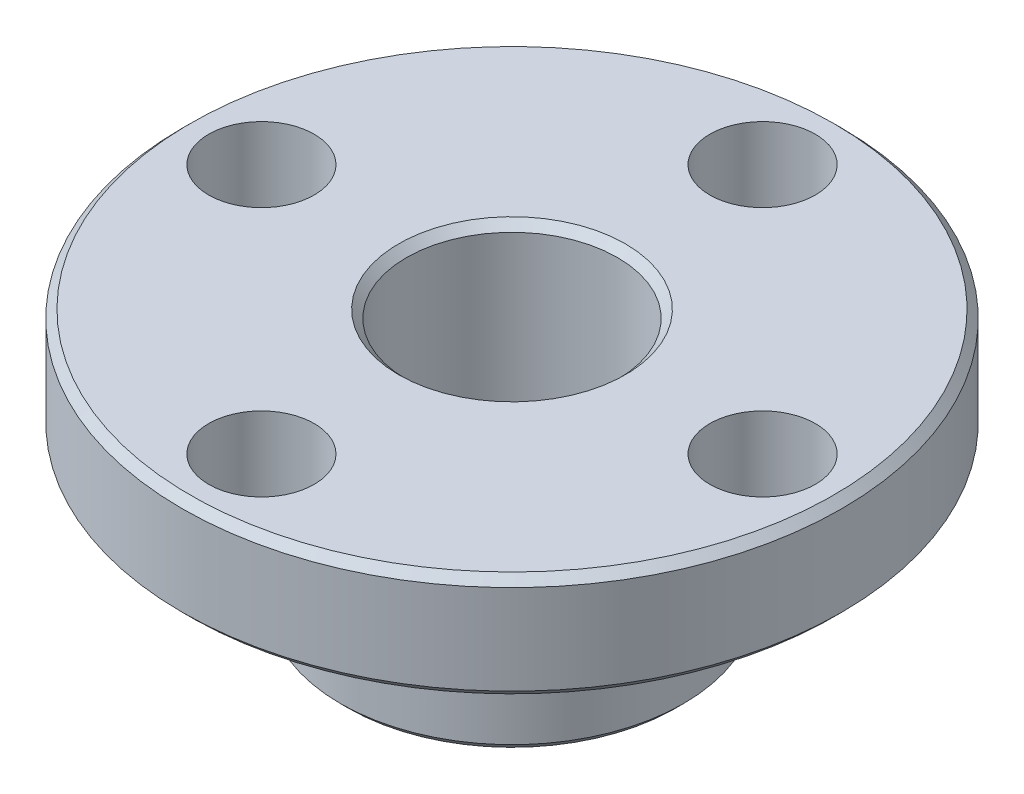
ISO-10303-21;
HEADER;
FILE_DESCRIPTION(('STEP AP214'),'2;1');
FILE_NAME('part.step','',(''),(''),'','','');
FILE_SCHEMA(('AUTOMOTIVE_DESIGN { 1 0 10303 214 1 1 1 1 }'));
ENDSEC;
DATA;
#1=APPLICATION_CONTEXT('core data for automotive mechanical design processes');
#2=APPLICATION_PROTOCOL_DEFINITION('international standard','automotive_design',2000,#1);
#3=PRODUCT_CONTEXT('',#1,'mechanical');
#4=PRODUCT('Part','Part','',(#3));
#5=PRODUCT_RELATED_PRODUCT_CATEGORY('part','',(#4));
#6=PRODUCT_DEFINITION_FORMATION('','',#4);
#7=PRODUCT_DEFINITION_CONTEXT('part definition',#1,'design');
#8=PRODUCT_DEFINITION('design','',#6,#7);
#9=PRODUCT_DEFINITION_SHAPE('','',#8);
#10=(LENGTH_UNIT() NAMED_UNIT(*) SI_UNIT(.MILLI.,.METRE.));
#11=(NAMED_UNIT(*) PLANE_ANGLE_UNIT() SI_UNIT($,.RADIAN.));
#12=(NAMED_UNIT(*) SI_UNIT($,.STERADIAN.) SOLID_ANGLE_UNIT());
#13=UNCERTAINTY_MEASURE_WITH_UNIT(LENGTH_MEASURE(1.E-05),#10,'distance_accuracy_value','');
#14=(GEOMETRIC_REPRESENTATION_CONTEXT(3) GLOBAL_UNCERTAINTY_ASSIGNED_CONTEXT((#13)) GLOBAL_UNIT_ASSIGNED_CONTEXT((#10,
#11,#12)) REPRESENTATION_CONTEXT('',''));
#15=CARTESIAN_POINT('',(0.,0.,0.));
#16=DIRECTION('',(0.,0.,1.));
#17=DIRECTION('',(1.,0.,0.));
#18=AXIS2_PLACEMENT_3D('',#15,#16,#17);
#19=CARTESIAN_POINT('',(0.,-9.70000000006621,0.));
#20=DIRECTION('',(0.,1.,0.));
#21=DIRECTION('',(0.,0.,1.));
#22=AXIS2_PLACEMENT_3D('',#19,#20,#21);
#23=CONICAL_SURFACE('',#22,6.4999999998463,0.785398163302709);
#24=CARTESIAN_POINT('',(0.,-9.99999999999091,0.));
#25=DIRECTION('',(0.,1.,0.));
#26=DIRECTION('',(0.,0.,1.));
#27=AXIS2_PLACEMENT_3D('',#24,#25,#26);
#28=CIRCLE('',#27,6.19999999997844);
#29=CARTESIAN_POINT('',(0.,-9.99999999999091,6.19999999997844));
#30=VERTEX_POINT('',#29);
#31=EDGE_CURVE('E17',#30,#30,#28,.F.);
#32=ORIENTED_EDGE('',*,*,#31,.F.);
#33=EDGE_LOOP('',(#32));
#34=FACE_BOUND('',#33,.T.);
#35=CARTESIAN_POINT('',(0.,-9.7,0.));
#36=DIRECTION('',(0.,-1.,0.));
#37=DIRECTION('',(0.,0.,-1.));
#38=AXIS2_PLACEMENT_3D('',#35,#36,#37);
#39=CIRCLE('',#38,6.5);
#40=CARTESIAN_POINT('',(0.,-9.7,-6.5));
#41=VERTEX_POINT('',#40);
#42=EDGE_CURVE('E29',#41,#41,#39,.F.);
#43=ORIENTED_EDGE('',*,*,#42,.F.);
#44=EDGE_LOOP('',(#43));
#45=FACE_BOUND('',#44,.T.);
#46=ADVANCED_FACE('F14',(#34,#45),#23,.T.);
#47=CARTESIAN_POINT('',(0.,-10.,0.));
#48=DIRECTION('',(0.,-1.,0.));
#49=DIRECTION('',(0.,0.,-1.));
#50=AXIS2_PLACEMENT_3D('',#47,#48,#49);
#51=PLANE('',#50);
#52=CARTESIAN_POINT('',(0.,-9.99999999993406,0.));
#53=DIRECTION('',(0.,-1.,0.));
#54=DIRECTION('',(0.,0.,-1.));
#55=AXIS2_PLACEMENT_3D('',#52,#53,#54);
#56=CIRCLE('',#55,4.29999999994379);
#57=CARTESIAN_POINT('',(0.,-9.99999999993406,-4.29999999994379));
#58=VERTEX_POINT('',#57);
#59=EDGE_CURVE('E64',#58,#58,#56,.F.);
#60=ORIENTED_EDGE('',*,*,#59,.T.);
#61=EDGE_LOOP('',(#60));
#62=FACE_BOUND('',#61,.T.);
#63=ORIENTED_EDGE('',*,*,#31,.T.);
#64=EDGE_LOOP('',(#63));
#65=FACE_BOUND('',#64,.T.);
#66=ADVANCED_FACE('F75',(#62,#65),#51,.T.);
#67=CARTESIAN_POINT('',(0.,-3.70000000000098,0.));
#68=DIRECTION('',(0.,1.,0.));
#69=DIRECTION('',(-1.,0.,0.));
#70=AXIS2_PLACEMENT_3D('',#67,#68,#69);
#71=CONICAL_SURFACE('',#70,12.500000000001,0.7853981633973);
#72=CARTESIAN_POINT('',(0.,-4.00000000000102,0.));
#73=DIRECTION('',(0.,1.,0.));
#74=DIRECTION('',(-1.,0.,0.));
#75=AXIS2_PLACEMENT_3D('',#72,#73,#74);
#76=CIRCLE('',#75,12.200000000001);
#77=CARTESIAN_POINT('',(-12.200000000001,-4.00000000000102,0.));
#78=VERTEX_POINT('',#77);
#79=EDGE_CURVE('E61',#78,#78,#76,.F.);
#80=ORIENTED_EDGE('',*,*,#79,.F.);
#81=EDGE_LOOP('',(#80));
#82=FACE_BOUND('',#81,.T.);
#83=CARTESIAN_POINT('',(0.,-3.7,0.));
#84=DIRECTION('',(0.,-1.,0.));
#85=DIRECTION('',(0.,0.,-1.));
#86=AXIS2_PLACEMENT_3D('',#83,#84,#85);
#87=CIRCLE('',#86,12.5);
#88=CARTESIAN_POINT('',(0.,-3.7,-12.5));
#89=VERTEX_POINT('',#88);
#90=EDGE_CURVE('E63',#89,#89,#87,.F.);
#91=ORIENTED_EDGE('',*,*,#90,.F.);
#92=EDGE_LOOP('',(#91));
#93=FACE_BOUND('',#92,.T.);
#94=ADVANCED_FACE('F83',(#82,#93),#71,.T.);
#95=CARTESIAN_POINT('',(0.,0.5,0.));
#96=DIRECTION('',(0.,-1.,0.));
#97=DIRECTION('',(0.,0.,-1.));
#98=AXIS2_PLACEMENT_3D('',#95,#96,#97);
#99=CYLINDRICAL_SURFACE('',#98,6.5);
#100=CARTESIAN_POINT('',(0.,-4.,0.));
#101=DIRECTION('',(0.,-1.,0.));
#102=DIRECTION('',(0.,0.,-1.));
#103=AXIS2_PLACEMENT_3D('',#100,#101,#102);
#104=CIRCLE('',#103,6.5);
#105=CARTESIAN_POINT('',(0.,-4.,-6.5));
#106=VERTEX_POINT('',#105);
#107=EDGE_CURVE('E57',#106,#106,#104,.F.);
#108=ORIENTED_EDGE('',*,*,#107,.F.);
#109=EDGE_LOOP('',(#108));
#110=FACE_BOUND('',#109,.T.);
#111=ORIENTED_EDGE('',*,*,#42,.T.);
#112=EDGE_LOOP('',(#111));
#113=FACE_BOUND('',#112,.T.);
#114=ADVANCED_FACE('F130',(#110,#113),#99,.T.);
#115=CARTESIAN_POINT('',(0.,-9.99999999987722,0.));
#116=DIRECTION('',(0.,-1.,0.));
#117=DIRECTION('',(0.,0.,-1.));
#118=AXIS2_PLACEMENT_3D('',#115,#116,#117);
#119=CONICAL_SURFACE('',#118,4.29999999988695,0.785398163397448);
#120=CARTESIAN_POINT('',(0.,-9.7,0.));
#121=DIRECTION('',(0.,-1.,0.));
#122=DIRECTION('',(0.,0.,-1.));
#123=AXIS2_PLACEMENT_3D('',#120,#121,#122);
#124=CIRCLE('',#123,4.);
#125=CARTESIAN_POINT('',(0.,-9.7,-4.));
#126=VERTEX_POINT('',#125);
#127=EDGE_CURVE('E60',#126,#126,#124,.F.);
#128=ORIENTED_EDGE('',*,*,#127,.T.);
#129=EDGE_LOOP('',(#128));
#130=FACE_BOUND('',#129,.T.);
#131=ORIENTED_EDGE('',*,*,#59,.F.);
#132=EDGE_LOOP('',(#131));
#133=FACE_BOUND('',#132,.T.);
#134=ADVANCED_FACE('F126',(#130,#133),#119,.F.);
#135=CARTESIAN_POINT('',(0.,0.5,0.));
#136=DIRECTION('',(0.,-1.,0.));
#137=DIRECTION('',(0.,0.,-1.));
#138=AXIS2_PLACEMENT_3D('',#135,#136,#137);
#139=CYLINDRICAL_SURFACE('',#138,12.5);
#140=ORIENTED_EDGE('',*,*,#90,.T.);
#141=EDGE_LOOP('',(#140));
#142=FACE_BOUND('',#141,.T.);
#143=CARTESIAN_POINT('',(0.,-0.299999999998073,0.));
#144=DIRECTION('',(0.,-1.,0.));
#145=DIRECTION('',(0.,0.,-1.));
#146=AXIS2_PLACEMENT_3D('',#143,#144,#145);
#147=CIRCLE('',#146,12.5000000000019);
#148=CARTESIAN_POINT('',(0.,-0.299999999998072,-12.5000000000019));
#149=VERTEX_POINT('',#148);
#150=EDGE_CURVE('E56',#149,#149,#147,.F.);
#151=ORIENTED_EDGE('',*,*,#150,.F.);
#152=EDGE_LOOP('',(#151));
#153=FACE_BOUND('',#152,.T.);
#154=ADVANCED_FACE('F122',(#142,#153),#139,.T.);
#155=CARTESIAN_POINT('',(0.,-4.,0.));
#156=DIRECTION('',(0.,-1.,0.));
#157=DIRECTION('',(0.,0.,-1.));
#158=AXIS2_PLACEMENT_3D('',#155,#156,#157);
#159=PLANE('',#158);
#160=ORIENTED_EDGE('',*,*,#107,.T.);
#161=EDGE_LOOP('',(#160));
#162=FACE_BOUND('',#161,.T.);
#163=CARTESIAN_POINT('',(-9.5,-4.,0.));
#164=DIRECTION('',(0.,1.,0.));
#165=DIRECTION('',(0.,0.,1.));
#166=AXIS2_PLACEMENT_3D('',#163,#164,#165);
#167=CIRCLE('',#166,2.);
#168=CARTESIAN_POINT('',(-9.5,-4.,2.));
#169=VERTEX_POINT('',#168);
#170=EDGE_CURVE('E47',#169,#169,#167,.T.);
#171=ORIENTED_EDGE('',*,*,#170,.T.);
#172=EDGE_LOOP('',(#171));
#173=FACE_BOUND('',#172,.T.);
#174=CARTESIAN_POINT('',(0.,-4.,9.5));
#175=DIRECTION('',(0.,1.,0.));
#176=DIRECTION('',(0.,0.,1.));
#177=AXIS2_PLACEMENT_3D('',#174,#175,#176);
#178=CIRCLE('',#177,2.);
#179=CARTESIAN_POINT('',(0.,-4.,11.5));
#180=VERTEX_POINT('',#179);
#181=EDGE_CURVE('E50',#180,#180,#178,.T.);
#182=ORIENTED_EDGE('',*,*,#181,.T.);
#183=EDGE_LOOP('',(#182));
#184=FACE_BOUND('',#183,.T.);
#185=CARTESIAN_POINT('',(9.5,-4.,0.));
#186=DIRECTION('',(0.,1.,0.));
#187=DIRECTION('',(0.,0.,1.));
#188=AXIS2_PLACEMENT_3D('',#185,#186,#187);
#189=CIRCLE('',#188,2.);
#190=CARTESIAN_POINT('',(9.5,-4.,2.));
#191=VERTEX_POINT('',#190);
#192=EDGE_CURVE('E53',#191,#191,#189,.T.);
#193=ORIENTED_EDGE('',*,*,#192,.T.);
#194=EDGE_LOOP('',(#193));
#195=FACE_BOUND('',#194,.T.);
#196=CARTESIAN_POINT('',(0.,-4.,-9.5));
#197=DIRECTION('',(0.,1.,0.));
#198=DIRECTION('',(0.,0.,1.));
#199=AXIS2_PLACEMENT_3D('',#196,#197,#198);
#200=CIRCLE('',#199,2.);
#201=CARTESIAN_POINT('',(0.,-4.,-7.5));
#202=VERTEX_POINT('',#201);
#203=EDGE_CURVE('E44',#202,#202,#200,.T.);
#204=ORIENTED_EDGE('',*,*,#203,.T.);
#205=EDGE_LOOP('',(#204));
#206=FACE_BOUND('',#205,.T.);
#207=ORIENTED_EDGE('',*,*,#79,.T.);
#208=EDGE_LOOP('',(#207));
#209=FACE_BOUND('',#208,.T.);
#210=ADVANCED_FACE('F118',(#162,#173,#184,#195,#206,#209),#159,.T.);
#211=CARTESIAN_POINT('',(0.,0.5,0.));
#212=DIRECTION('',(0.,-1.,0.));
#213=DIRECTION('',(0.,0.,-1.));
#214=AXIS2_PLACEMENT_3D('',#211,#212,#213);
#215=CYLINDRICAL_SURFACE('',#214,4.);
#216=ORIENTED_EDGE('',*,*,#127,.F.);
#217=EDGE_LOOP('',(#216));
#218=FACE_BOUND('',#217,.T.);
#219=CARTESIAN_POINT('',(0.,-0.300000000038381,0.));
#220=DIRECTION('',(0.,1.,0.));
#221=DIRECTION('',(0.,0.,-1.));
#222=AXIS2_PLACEMENT_3D('',#219,#220,#221);
#223=CIRCLE('',#222,3.99999999996226);
#224=CARTESIAN_POINT('',(0.,-0.300000000038381,-3.99999999996226));
#225=VERTEX_POINT('',#224);
#226=EDGE_CURVE('E43',#225,#225,#223,.T.);
#227=ORIENTED_EDGE('',*,*,#226,.T.);
#228=EDGE_LOOP('',(#227));
#229=FACE_BOUND('',#228,.T.);
#230=ADVANCED_FACE('F114',(#218,#229),#215,.F.);
#231=CARTESIAN_POINT('',(0.,-0.299999999998072,0.));
#232=DIRECTION('',(0.,-1.,0.));
#233=DIRECTION('',(0.,0.,-1.));
#234=AXIS2_PLACEMENT_3D('',#231,#232,#233);
#235=CONICAL_SURFACE('',#234,12.5000000000019,0.7853981633973);
#236=ORIENTED_EDGE('',*,*,#150,.T.);
#237=EDGE_LOOP('',(#236));
#238=FACE_BOUND('',#237,.T.);
#239=CARTESIAN_POINT('',(0.,1.97238059218563E-12,0.));
#240=DIRECTION('',(0.,-1.,0.));
#241=DIRECTION('',(0.,0.,-1.));
#242=AXIS2_PLACEMENT_3D('',#239,#240,#241);
#243=CIRCLE('',#242,12.200000000002);
#244=CARTESIAN_POINT('',(0.,1.97238059218563E-12,-12.200000000002));
#245=VERTEX_POINT('',#244);
#246=EDGE_CURVE('E40',#245,#245,#243,.T.);
#247=ORIENTED_EDGE('',*,*,#246,.T.);
#248=EDGE_LOOP('',(#247));
#249=FACE_BOUND('',#248,.T.);
#250=ADVANCED_FACE('F110',(#238,#249),#235,.T.);
#251=CARTESIAN_POINT('',(9.5,0.,0.));
#252=DIRECTION('',(0.,1.,0.));
#253=DIRECTION('',(0.,0.,1.));
#254=AXIS2_PLACEMENT_3D('',#251,#252,#253);
#255=CYLINDRICAL_SURFACE('',#254,2.);
#256=ORIENTED_EDGE('',*,*,#192,.F.);
#257=EDGE_LOOP('',(#256));
#258=FACE_BOUND('',#257,.T.);
#259=CARTESIAN_POINT('',(9.5,0.,0.));
#260=DIRECTION('',(0.,1.,0.));
#261=DIRECTION('',(0.,0.,1.));
#262=AXIS2_PLACEMENT_3D('',#259,#260,#261);
#263=CIRCLE('',#262,2.);
#264=CARTESIAN_POINT('',(9.5,0.,2.));
#265=VERTEX_POINT('',#264);
#266=EDGE_CURVE('E37',#265,#265,#263,.T.);
#267=ORIENTED_EDGE('',*,*,#266,.T.);
#268=EDGE_LOOP('',(#267));
#269=FACE_BOUND('',#268,.T.);
#270=ADVANCED_FACE('F106',(#258,#269),#255,.F.);
#271=CARTESIAN_POINT('',(0.,0.,9.5));
#272=DIRECTION('',(0.,1.,0.));
#273=DIRECTION('',(0.,0.,1.));
#274=AXIS2_PLACEMENT_3D('',#271,#272,#273);
#275=CYLINDRICAL_SURFACE('',#274,2.);
#276=ORIENTED_EDGE('',*,*,#181,.F.);
#277=EDGE_LOOP('',(#276));
#278=FACE_BOUND('',#277,.T.);
#279=CARTESIAN_POINT('',(0.,0.,9.5));
#280=DIRECTION('',(0.,1.,0.));
#281=DIRECTION('',(0.,0.,1.));
#282=AXIS2_PLACEMENT_3D('',#279,#280,#281);
#283=CIRCLE('',#282,2.);
#284=CARTESIAN_POINT('',(0.,0.,11.5));
#285=VERTEX_POINT('',#284);
#286=EDGE_CURVE('E34',#285,#285,#283,.T.);
#287=ORIENTED_EDGE('',*,*,#286,.T.);
#288=EDGE_LOOP('',(#287));
#289=FACE_BOUND('',#288,.T.);
#290=ADVANCED_FACE('F102',(#278,#289),#275,.F.);
#291=CARTESIAN_POINT('',(-9.5,0.,0.));
#292=DIRECTION('',(0.,1.,0.));
#293=DIRECTION('',(0.,0.,1.));
#294=AXIS2_PLACEMENT_3D('',#291,#292,#293);
#295=CYLINDRICAL_SURFACE('',#294,2.);
#296=ORIENTED_EDGE('',*,*,#170,.F.);
#297=EDGE_LOOP('',(#296));
#298=FACE_BOUND('',#297,.T.);
#299=CARTESIAN_POINT('',(-9.5,0.,0.));
#300=DIRECTION('',(0.,1.,0.));
#301=DIRECTION('',(0.,0.,1.));
#302=AXIS2_PLACEMENT_3D('',#299,#300,#301);
#303=CIRCLE('',#302,2.);
#304=CARTESIAN_POINT('',(-9.5,0.,2.));
#305=VERTEX_POINT('',#304);
#306=EDGE_CURVE('E26',#305,#305,#303,.T.);
#307=ORIENTED_EDGE('',*,*,#306,.T.);
#308=EDGE_LOOP('',(#307));
#309=FACE_BOUND('',#308,.T.);
#310=ADVANCED_FACE('F98',(#298,#309),#295,.F.);
#311=CARTESIAN_POINT('',(0.,0.,-9.5));
#312=DIRECTION('',(0.,1.,0.));
#313=DIRECTION('',(0.,0.,1.));
#314=AXIS2_PLACEMENT_3D('',#311,#312,#313);
#315=CYLINDRICAL_SURFACE('',#314,2.);
#316=ORIENTED_EDGE('',*,*,#203,.F.);
#317=EDGE_LOOP('',(#316));
#318=FACE_BOUND('',#317,.T.);
#319=CARTESIAN_POINT('',(0.,0.,-9.5));
#320=DIRECTION('',(0.,1.,0.));
#321=DIRECTION('',(0.,0.,1.));
#322=AXIS2_PLACEMENT_3D('',#319,#320,#321);
#323=CIRCLE('',#322,2.);
#324=CARTESIAN_POINT('',(0.,0.,-7.5));
#325=VERTEX_POINT('',#324);
#326=EDGE_CURVE('E21',#325,#325,#323,.T.);
#327=ORIENTED_EDGE('',*,*,#326,.T.);
#328=EDGE_LOOP('',(#327));
#329=FACE_BOUND('',#328,.T.);
#330=ADVANCED_FACE('F92',(#318,#329),#315,.F.);
#331=CARTESIAN_POINT('',(0.,-1.13686837721616E-10,0.));
#332=DIRECTION('',(0.,1.,0.));
#333=DIRECTION('',(0.,0.,1.));
#334=AXIS2_PLACEMENT_3D('',#331,#332,#333);
#335=CONICAL_SURFACE('',#334,4.29999999988695,0.785398163397448);
#336=CARTESIAN_POINT('',(0.,-5.6843418860808E-11,0.));
#337=DIRECTION('',(0.,1.,0.));
#338=DIRECTION('',(0.,0.,1.));
#339=AXIS2_PLACEMENT_3D('',#336,#337,#338);
#340=CIRCLE('',#339,4.29999999994379);
#341=CARTESIAN_POINT('',(0.,-5.6843418860808E-11,4.29999999994379));
#342=VERTEX_POINT('',#341);
#343=EDGE_CURVE('E10',#342,#342,#340,.T.);
#344=ORIENTED_EDGE('',*,*,#343,.T.);
#345=EDGE_LOOP('',(#344));
#346=FACE_BOUND('',#345,.T.);
#347=ORIENTED_EDGE('',*,*,#226,.F.);
#348=EDGE_LOOP('',(#347));
#349=FACE_BOUND('',#348,.T.);
#350=ADVANCED_FACE('F86',(#346,#349),#335,.F.);
#351=CARTESIAN_POINT('',(0.,0.,0.));
#352=DIRECTION('',(0.,-1.,0.));
#353=DIRECTION('',(0.,0.,-1.));
#354=AXIS2_PLACEMENT_3D('',#351,#352,#353);
#355=PLANE('',#354);
#356=ORIENTED_EDGE('',*,*,#343,.F.);
#357=EDGE_LOOP('',(#356));
#358=FACE_BOUND('',#357,.T.);
#359=ORIENTED_EDGE('',*,*,#326,.F.);
#360=EDGE_LOOP('',(#359));
#361=FACE_BOUND('',#360,.T.);
#362=ORIENTED_EDGE('',*,*,#306,.F.);
#363=EDGE_LOOP('',(#362));
#364=FACE_BOUND('',#363,.T.);
#365=ORIENTED_EDGE('',*,*,#286,.F.);
#366=EDGE_LOOP('',(#365));
#367=FACE_BOUND('',#366,.T.);
#368=ORIENTED_EDGE('',*,*,#266,.F.);
#369=EDGE_LOOP('',(#368));
#370=FACE_BOUND('',#369,.T.);
#371=ORIENTED_EDGE('',*,*,#246,.F.);
#372=EDGE_LOOP('',(#371));
#373=FACE_BOUND('',#372,.T.);
#374=ADVANCED_FACE('F84',(#358,#361,#364,#367,#370,#373),#355,.F.);
#375=CLOSED_SHELL('',(#46,#66,#94,#114,#134,#154,#210,#230,#250,#270,#290,#310,#330,#350,#374));
#376=MANIFOLD_SOLID_BREP('B1',#375);
#377=ADVANCED_BREP_SHAPE_REPRESENTATION('',(#18,#376),#14);
#378=SHAPE_DEFINITION_REPRESENTATION(#9,#377);
ENDSEC;
END-ISO-10303-21;
